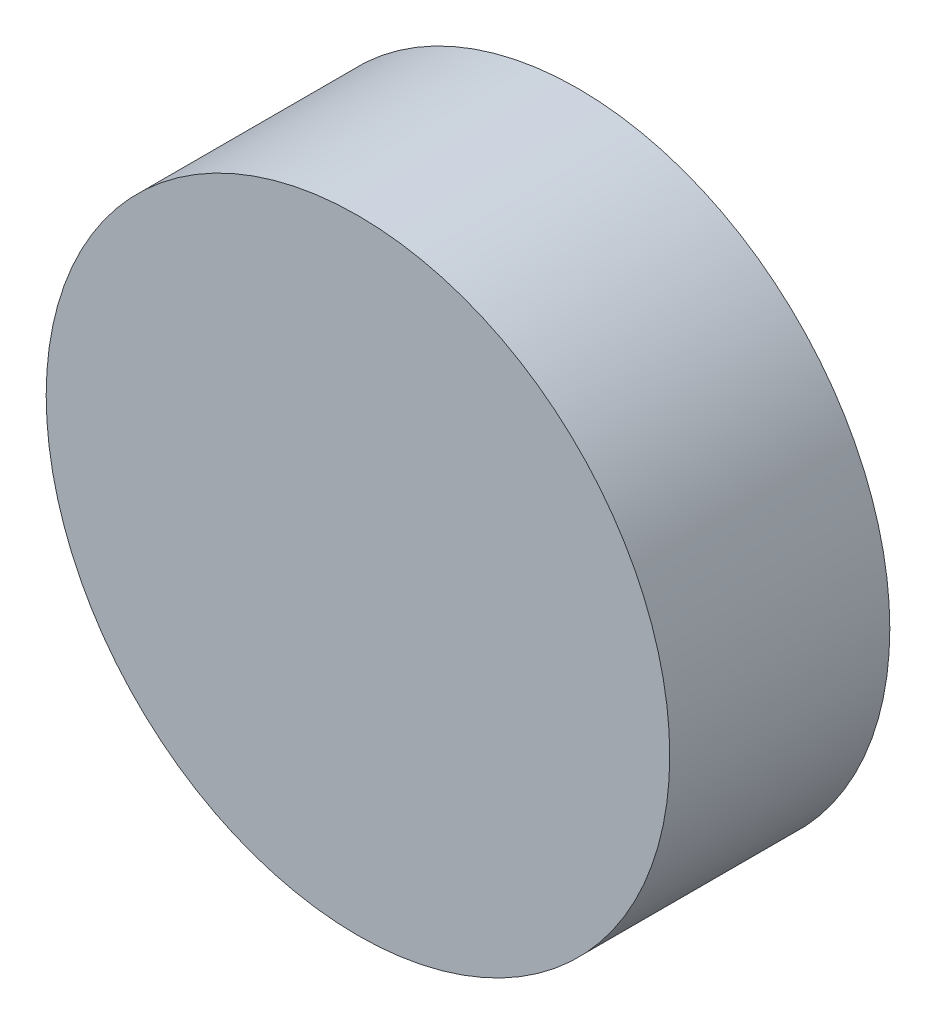
ISO-10303-21;
HEADER;
FILE_DESCRIPTION(('STEP AP214'),'2;1');
FILE_NAME('part.step','',(''),(''),'','','');
FILE_SCHEMA(('AUTOMOTIVE_DESIGN { 1 0 10303 214 1 1 1 1 }'));
ENDSEC;
DATA;
#1=APPLICATION_CONTEXT('core data for automotive mechanical design processes');
#2=APPLICATION_PROTOCOL_DEFINITION('international standard','automotive_design',2000,#1);
#3=PRODUCT_CONTEXT('',#1,'mechanical');
#4=PRODUCT('Part','Part','',(#3));
#5=PRODUCT_RELATED_PRODUCT_CATEGORY('part','',(#4));
#6=PRODUCT_DEFINITION_FORMATION('','',#4);
#7=PRODUCT_DEFINITION_CONTEXT('part definition',#1,'design');
#8=PRODUCT_DEFINITION('design','',#6,#7);
#9=PRODUCT_DEFINITION_SHAPE('','',#8);
#10=(LENGTH_UNIT() NAMED_UNIT(*) SI_UNIT(.MILLI.,.METRE.));
#11=(NAMED_UNIT(*) PLANE_ANGLE_UNIT() SI_UNIT($,.RADIAN.));
#12=(NAMED_UNIT(*) SI_UNIT($,.STERADIAN.) SOLID_ANGLE_UNIT());
#13=UNCERTAINTY_MEASURE_WITH_UNIT(LENGTH_MEASURE(1.E-05),#10,'distance_accuracy_value','');
#14=(GEOMETRIC_REPRESENTATION_CONTEXT(3) GLOBAL_UNCERTAINTY_ASSIGNED_CONTEXT((#13)) GLOBAL_UNIT_ASSIGNED_CONTEXT((#10,
#11,#12)) REPRESENTATION_CONTEXT('',''));
#15=CARTESIAN_POINT('',(0.,0.,0.));
#16=DIRECTION('',(0.,0.,1.));
#17=DIRECTION('',(1.,0.,0.));
#18=AXIS2_PLACEMENT_3D('',#15,#16,#17);
#19=CARTESIAN_POINT('',(0.,0.,0.03));
#20=DIRECTION('',(0.,0.,-1.));
#21=DIRECTION('',(-1.,0.,0.));
#22=AXIS2_PLACEMENT_3D('',#19,#20,#21);
#23=CYLINDRICAL_SURFACE('',#22,0.0425000000000009);
#24=CARTESIAN_POINT('',(0.,0.,0.03));
#25=DIRECTION('',(0.,0.,1.));
#26=DIRECTION('',(1.,0.,0.));
#27=AXIS2_PLACEMENT_3D('',#24,#25,#26);
#28=CIRCLE('',#27,0.0425000000000009);
#29=CARTESIAN_POINT('',(0.0425000000000009,0.,0.03));
#30=VERTEX_POINT('',#29);
#31=EDGE_CURVE('E10',#30,#30,#28,.T.);
#32=ORIENTED_EDGE('',*,*,#31,.F.);
#33=EDGE_LOOP('',(#32));
#34=FACE_BOUND('',#33,.T.);
#35=CARTESIAN_POINT('',(0.,0.,0.));
#36=DIRECTION('',(0.,0.,1.));
#37=DIRECTION('',(1.,0.,0.));
#38=AXIS2_PLACEMENT_3D('',#35,#36,#37);
#39=CIRCLE('',#38,0.0425000000000009);
#40=CARTESIAN_POINT('',(0.0425000000000009,0.,0.));
#41=VERTEX_POINT('',#40);
#42=EDGE_CURVE('E40',#41,#41,#39,.T.);
#43=ORIENTED_EDGE('',*,*,#42,.T.);
#44=EDGE_LOOP('',(#43));
#45=FACE_BOUND('',#44,.T.);
#46=ADVANCED_FACE('F37',(#34,#45),#23,.T.);
#47=CARTESIAN_POINT('',(0.,0.,0.03));
#48=DIRECTION('',(0.,0.,1.));
#49=DIRECTION('',(1.,0.,0.));
#50=AXIS2_PLACEMENT_3D('',#47,#48,#49);
#51=PLANE('',#50);
#52=ORIENTED_EDGE('',*,*,#31,.T.);
#53=EDGE_LOOP('',(#52));
#54=FACE_BOUND('',#53,.T.);
#55=ADVANCED_FACE('F54',(#54),#51,.T.);
#56=CARTESIAN_POINT('',(0.,0.,0.));
#57=DIRECTION('',(0.,0.,1.));
#58=DIRECTION('',(1.,0.,0.));
#59=AXIS2_PLACEMENT_3D('',#56,#57,#58);
#60=PLANE('',#59);
#61=ORIENTED_EDGE('',*,*,#42,.F.);
#62=EDGE_LOOP('',(#61));
#63=FACE_BOUND('',#62,.T.);
#64=ADVANCED_FACE('F52',(#63),#60,.F.);
#65=CLOSED_SHELL('',(#46,#55,#64));
#66=MANIFOLD_SOLID_BREP('B2',#65);
#67=ADVANCED_BREP_SHAPE_REPRESENTATION('',(#18,#66),#14);
#68=SHAPE_DEFINITION_REPRESENTATION(#9,#67);
ENDSEC;
END-ISO-10303-21;
